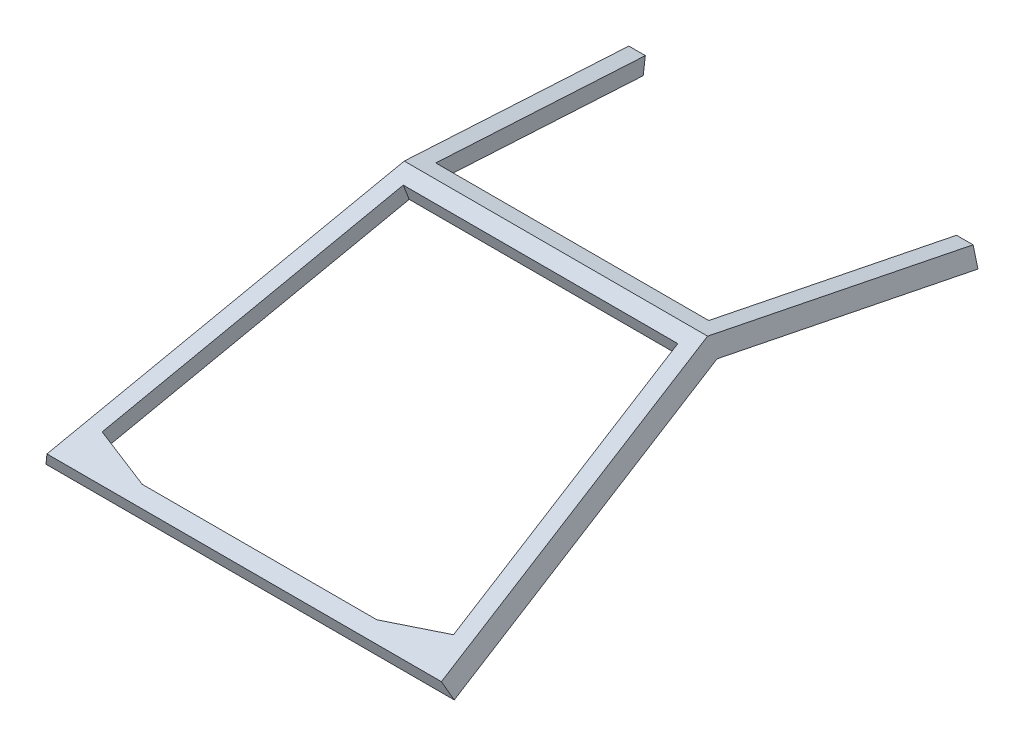
ISO-10303-21;
HEADER;
FILE_DESCRIPTION(('STEP AP214'),'2;1');
FILE_NAME('part.step','',(''),(''),'','','');
FILE_SCHEMA(('AUTOMOTIVE_DESIGN { 1 0 10303 214 1 1 1 1 }'));
ENDSEC;
DATA;
#1=APPLICATION_CONTEXT('core data for automotive mechanical design processes');
#2=APPLICATION_PROTOCOL_DEFINITION('international standard','automotive_design',2000,#1);
#3=PRODUCT_CONTEXT('',#1,'mechanical');
#4=PRODUCT('Part','Part','',(#3));
#5=PRODUCT_RELATED_PRODUCT_CATEGORY('part','',(#4));
#6=PRODUCT_DEFINITION_FORMATION('','',#4);
#7=PRODUCT_DEFINITION_CONTEXT('part definition',#1,'design');
#8=PRODUCT_DEFINITION('design','',#6,#7);
#9=PRODUCT_DEFINITION_SHAPE('','',#8);
#10=(LENGTH_UNIT() NAMED_UNIT(*) SI_UNIT(.MILLI.,.METRE.));
#11=(NAMED_UNIT(*) PLANE_ANGLE_UNIT() SI_UNIT($,.RADIAN.));
#12=(NAMED_UNIT(*) SI_UNIT($,.STERADIAN.) SOLID_ANGLE_UNIT());
#13=UNCERTAINTY_MEASURE_WITH_UNIT(LENGTH_MEASURE(1.E-05),#10,'distance_accuracy_value','');
#14=(GEOMETRIC_REPRESENTATION_CONTEXT(3) GLOBAL_UNCERTAINTY_ASSIGNED_CONTEXT((#13)) GLOBAL_UNIT_ASSIGNED_CONTEXT((#10,
#11,#12)) REPRESENTATION_CONTEXT('',''));
#15=CARTESIAN_POINT('',(0.,0.,0.));
#16=DIRECTION('',(0.,0.,1.));
#17=DIRECTION('',(1.,0.,0.));
#18=AXIS2_PLACEMENT_3D('',#15,#16,#17);
#19=CARTESIAN_POINT('',(0.,164.649706155274,63.6645530467058));
#20=DIRECTION('',(0.,-0.932703085043673,-0.360645192883553));
#21=DIRECTION('',(0.,0.360645192883553,-0.932703085043673));
#22=AXIS2_PLACEMENT_3D('',#19,#20,#21);
#23=PLANE('',#22);
#24=DIRECTION('',(-0.135068951217253,0.357340313044943,-0.924155982012784));
#25=VECTOR('',#24,1.);
#26=CARTESIAN_POINT('',(119.903816342687,73.0935278708853,300.447772747711));
#27=LINE('',#26,#25);
#28=CARTESIAN_POINT('',(118.281522677248,77.3854907612064,289.347868721018));
#29=VERTEX_POINT('',#28);
#30=CARTESIAN_POINT('',(106.635347964785,108.196774035582,209.663515425218));
#31=VERTEX_POINT('',#30);
#32=EDGE_CURVE('E335',#29,#31,#27,.T.);
#33=ORIENTED_EDGE('',*,*,#32,.F.);
#34=DIRECTION('',(-0.947950198198769,-0.114836146990365,0.296990035319911));
#35=VECTOR('',#34,1.);
#36=CARTESIAN_POINT('',(118.281522677248,77.3854907612063,289.347868721018));
#37=LINE('',#36,#35);
#38=CARTESIAN_POINT('',(100.5828713665,75.2414488829367,294.892804613095));
#39=VERTEX_POINT('',#38);
#40=EDGE_CURVE('E393',#29,#39,#37,.T.);
#41=ORIENTED_EDGE('',*,*,#40,.T.);
#42=DIRECTION('',(-1.,0.,0.));
#43=VECTOR('',#42,1.);
#44=CARTESIAN_POINT('',(65.,75.2414488829367,294.892804613095));
#45=LINE('',#44,#43);
#46=CARTESIAN_POINT('',(29.4171286334995,75.2414488829367,294.892804613095));
#47=VERTEX_POINT('',#46);
#48=EDGE_CURVE('E397',#39,#47,#45,.T.);
#49=ORIENTED_EDGE('',*,*,#48,.T.);
#50=DIRECTION('',(-0.947950198198769,0.114836146990365,-0.296990035319911));
#51=VECTOR('',#50,1.);
#52=CARTESIAN_POINT('',(11.7184773227523,77.3854907612063,289.347868721018));
#53=LINE('',#52,#51);
#54=CARTESIAN_POINT('',(11.7184773227524,77.3854907612064,289.347868721018));
#55=VERTEX_POINT('',#54);
#56=EDGE_CURVE('E398',#47,#55,#53,.T.);
#57=ORIENTED_EDGE('',*,*,#56,.T.);
#58=DIRECTION('',(-0.135068951217253,-0.357340313044943,0.924155982012784));
#59=VECTOR('',#58,1.);
#60=CARTESIAN_POINT('',(10.0961836573128,73.0935278708853,300.447772747711));
#61=LINE('',#60,#59);
#62=CARTESIAN_POINT('',(23.3646520352154,108.196774035582,209.663515425218));
#63=VERTEX_POINT('',#62);
#64=EDGE_CURVE('E457',#63,#55,#61,.T.);
#65=ORIENTED_EDGE('',*,*,#64,.F.);
#66=DIRECTION('',(-1.,0.,0.));
#67=VECTOR('',#66,1.);
#68=CARTESIAN_POINT('',(23.3646520352154,108.196774035582,209.663515425218));
#69=LINE('',#68,#67);
#70=EDGE_CURVE('E462',#31,#63,#69,.T.);
#71=ORIENTED_EDGE('',*,*,#70,.F.);
#72=EDGE_LOOP('',(#33,#41,#49,#57,#65,#71));
#73=FACE_BOUND('',#72,.T.);
#74=CARTESIAN_POINT('',(5.18023014824659,73.4382229185188,299.556320038313));
#75=DIRECTION('',(0.135068951217253,0.357340313044943,-0.924155982012784));
#76=VECTOR('',#75,1.);
#77=LINE('',#74,#76);
#78=CARTESIAN_POINT('',(5.18023014824665,73.4382229185189,299.556320038313));
#79=VERTEX_POINT('',#78);
#80=CARTESIAN_POINT('',(19.,110.,205.));
#81=VERTEX_POINT('',#80);
#82=EDGE_CURVE('E507',#79,#81,#77,.T.);
#83=ORIENTED_EDGE('',*,*,#82,.F.);
#84=DIRECTION('',(1.,0.,0.));
#85=VECTOR('',#84,1.);
#86=CARTESIAN_POINT('',(-6.41570742901576,73.4382229185189,299.556320038313));
#87=LINE('',#86,#85);
#88=CARTESIAN_POINT('',(124.819769851753,73.4382229185189,299.556320038313));
#89=VERTEX_POINT('',#88);
#90=EDGE_CURVE('E409',#79,#89,#87,.T.);
#91=ORIENTED_EDGE('',*,*,#90,.T.);
#92=DIRECTION('',(-0.135068951217253,0.357340313044943,-0.924155982012784));
#93=VECTOR('',#92,1.);
#94=CARTESIAN_POINT('',(130.,59.7333333333333,335.));
#95=LINE('',#94,#93);
#96=CARTESIAN_POINT('',(111.,110.,205.));
#97=VERTEX_POINT('',#96);
#98=EDGE_CURVE('E565',#89,#97,#95,.T.);
#99=ORIENTED_EDGE('',*,*,#98,.T.);
#100=DIRECTION('',(1.,0.,0.));
#101=VECTOR('',#100,1.);
#102=CARTESIAN_POINT('',(0.,110.,205.));
#103=LINE('',#102,#101);
#104=EDGE_CURVE('E615',#81,#97,#103,.T.);
#105=ORIENTED_EDGE('',*,*,#104,.F.);
#106=EDGE_LOOP('',(#83,#91,#99,#105));
#107=FACE_BOUND('',#106,.T.);
#108=ADVANCED_FACE('F192',(#73,#107),#23,.F.);
#109=CARTESIAN_POINT('',(0.,80.7859594277753,-10.929865099052));
#110=DIRECTION('',(0.,0.99097150999577,-0.134072616058251));
#111=DIRECTION('',(0.,0.134072616058251,0.99097150999577));
#112=AXIS2_PLACEMENT_3D('',#109,#110,#111);
#113=PLANE('',#112);
#114=DIRECTION('',(0.082492367586561,-0.133615655875355,-0.987593978209144));
#115=VECTOR('',#114,1.);
#116=CARTESIAN_POINT('',(106.396772641455,109.329636919709,200.045142450021));
#117=LINE('',#116,#115);
#118=CARTESIAN_POINT('',(106.396772641455,109.329636919709,200.045142450021));
#119=VERTEX_POINT('',#118);
#120=CARTESIAN_POINT('',(112.190986813663,99.9445537956311,130.677136750317));
#121=VERTEX_POINT('',#120);
#122=EDGE_CURVE('E441',#119,#121,#117,.T.);
#123=ORIENTED_EDGE('',*,*,#122,.F.);
#124=DIRECTION('',(1.,0.,0.));
#125=VECTOR('',#124,1.);
#126=CARTESIAN_POINT('',(23.6032273585454,109.329636919709,200.045142450021));
#127=LINE('',#126,#125);
#128=CARTESIAN_POINT('',(23.6032273585454,109.329636919709,200.045142450021));
#129=VERTEX_POINT('',#128);
#130=EDGE_CURVE('E445',#129,#119,#127,.T.);
#131=ORIENTED_EDGE('',*,*,#130,.F.);
#132=DIRECTION('',(0.0824923675865611,0.133615655875355,0.987593978209144));
#133=VECTOR('',#132,1.);
#134=CARTESIAN_POINT('',(23.6032273585454,109.329636919709,200.045142450021));
#135=LINE('',#134,#133);
#136=CARTESIAN_POINT('',(17.8090131863374,99.9445537956312,130.677136750317));
#137=VERTEX_POINT('',#136);
#138=EDGE_CURVE('E330',#137,#129,#135,.T.);
#139=ORIENTED_EDGE('',*,*,#138,.F.);
#140=DIRECTION('',(1.,0.,0.));
#141=VECTOR('',#140,1.);
#142=CARTESIAN_POINT('',(0.,99.9445537956311,130.677136750317));
#143=LINE('',#142,#141);
#144=CARTESIAN_POINT('',(12.7919133869202,99.9445537956311,130.677136750317));
#145=VERTEX_POINT('',#144);
#146=EDGE_CURVE('E576',#145,#137,#143,.T.);
#147=ORIENTED_EDGE('',*,*,#146,.F.);
#148=CARTESIAN_POINT('',(19.0000000000001,110.,205.));
#149=DIRECTION('',(-0.0824923675865611,-0.133615655875355,-0.987593978209144));
#150=VECTOR('',#149,1.);
#151=LINE('',#148,#150);
#152=EDGE_CURVE('E516',#81,#145,#151,.T.);
#153=ORIENTED_EDGE('',*,*,#152,.F.);
#154=ORIENTED_EDGE('',*,*,#104,.T.);
#155=CARTESIAN_POINT('',(111.,110.,205.));
#156=DIRECTION('',(0.082492367586561,-0.133615655875355,-0.987593978209144));
#157=VECTOR('',#156,1.);
#158=LINE('',#155,#157);
#159=CARTESIAN_POINT('',(117.20808661308,99.9445537956311,130.677136750317));
#160=VERTEX_POINT('',#159);
#161=EDGE_CURVE('E562',#97,#160,#158,.T.);
#162=ORIENTED_EDGE('',*,*,#161,.T.);
#163=EDGE_CURVE('E573',#121,#160,#143,.T.);
#164=ORIENTED_EDGE('',*,*,#163,.F.);
#165=EDGE_LOOP('',(#123,#131,#139,#147,#153,#154,#162,#164));
#166=FACE_BOUND('',#165,.T.);
#167=ADVANCED_FACE('F542',(#166),#113,.T.);
#168=CARTESIAN_POINT('',(137.599826435722,60.5491239754368,3.30158407348643));
#169=DIRECTION('',(0.915081624245218,0.402670498570365,0.0219565605190602));
#170=DIRECTION('',(-0.402767595499937,0.915302280132197,0.));
#171=AXIS2_PLACEMENT_3D('',#168,#169,#170);
#172=PLANE('',#171);
#173=DIRECTION('',(0.135068951217253,-0.357340313044943,0.924155982012784));
#174=VECTOR('',#173,1.);
#175=CARTESIAN_POINT('',(90.7522545245122,164.447796904632,50.3226904239006));
#176=LINE('',#175,#174);
#177=CARTESIAN_POINT('',(113.27067677839,104.87274294174,204.396105845172));
#178=VERTEX_POINT('',#177);
#179=CARTESIAN_POINT('',(126.915159673358,68.7747074933006,297.753094073895));
#180=VERTEX_POINT('',#179);
#181=EDGE_CURVE('E490',#178,#180,#176,.T.);
#182=ORIENTED_EDGE('',*,*,#181,.F.);
#183=DIRECTION('',(-0.0824923675865604,0.133615655875353,0.987593978209144));
#184=VECTOR('',#183,1.);
#185=CARTESIAN_POINT('',(130.30774604296,77.2772301618385,0.429272254592008));
#186=LINE('',#185,#184);
#187=CARTESIAN_POINT('',(119.372326436043,94.9896962456523,131.347499830608));
#188=VERTEX_POINT('',#187);
#189=EDGE_CURVE('E496',#188,#178,#186,.T.);
#190=ORIENTED_EDGE('',*,*,#189,.F.);
#191=DIRECTION('',(0.397232391805709,-0.909432445864631,0.123040860322863));
#192=VECTOR('',#191,1.);
#193=CARTESIAN_POINT('',(128.432024529086,74.2482271068976,134.15369859644));
#194=LINE('',#193,#192);
#195=EDGE_CURVE('E434',#160,#188,#194,.T.);
#196=ORIENTED_EDGE('',*,*,#195,.F.);
#197=ORIENTED_EDGE('',*,*,#161,.F.);
#198=ORIENTED_EDGE('',*,*,#98,.F.);
#199=DIRECTION('',(-0.386509498906153,0.860218462244048,0.332617805401034));
#200=VECTOR('',#199,1.);
#201=CARTESIAN_POINT('',(169.100869979237,-25.1141282292271,261.449410927851));
#202=LINE('',#201,#200);
#203=EDGE_CURVE('E433',#180,#89,#202,.T.);
#204=ORIENTED_EDGE('',*,*,#203,.F.);
#205=EDGE_LOOP('',(#182,#190,#196,#197,#198,#204));
#206=FACE_BOUND('',#205,.T.);
#207=ADVANCED_FACE('F536',(#206),#172,.T.);
#208=CARTESIAN_POINT('',(-7.59982643572174,60.5491239754368,3.30158407348643));
#209=DIRECTION('',(-0.915081624245218,0.402670498570365,0.0219565605190602));
#210=DIRECTION('',(0.402767595499937,0.915302280132197,0.));
#211=AXIS2_PLACEMENT_3D('',#208,#209,#210);
#212=PLANE('',#211);
#213=DIRECTION('',(-0.0824923675865604,-0.133615655875353,-0.987593978209144));
#214=VECTOR('',#213,1.);
#215=CARTESIAN_POINT('',(-0.307746042959867,77.2772301618385,0.429272254592008));
#216=LINE('',#215,#214);
#217=CARTESIAN_POINT('',(16.7293232216096,104.87274294174,204.396105845172));
#218=VERTEX_POINT('',#217);
#219=CARTESIAN_POINT('',(10.6276735639574,94.9896962456523,131.347499830608));
#220=VERTEX_POINT('',#219);
#221=EDGE_CURVE('E493',#218,#220,#216,.T.);
#222=ORIENTED_EDGE('',*,*,#221,.F.);
#223=DIRECTION('',(0.135068951217253,0.357340313044943,-0.924155982012784));
#224=VECTOR('',#223,1.);
#225=CARTESIAN_POINT('',(39.2477454754878,164.447796904632,50.3226904239006));
#226=LINE('',#225,#224);
#227=CARTESIAN_POINT('',(3.08484032664237,68.7747074933006,297.753094073895));
#228=VERTEX_POINT('',#227);
#229=EDGE_CURVE('E486',#228,#218,#226,.T.);
#230=ORIENTED_EDGE('',*,*,#229,.F.);
#231=DIRECTION('',(-0.386509498906153,-0.860218462244048,-0.332617805401034));
#232=VECTOR('',#231,1.);
#233=CARTESIAN_POINT('',(-39.1008699792369,-25.1141282292271,261.449410927851));
#234=LINE('',#233,#232);
#235=EDGE_CURVE('E429',#79,#228,#234,.T.);
#236=ORIENTED_EDGE('',*,*,#235,.F.);
#237=ORIENTED_EDGE('',*,*,#82,.T.);
#238=ORIENTED_EDGE('',*,*,#152,.T.);
#239=DIRECTION('',(0.397232391805709,0.909432445864631,-0.123040860322863));
#240=VECTOR('',#239,1.);
#241=CARTESIAN_POINT('',(1.56797547091377,74.2482271068976,134.15369859644));
#242=LINE('',#241,#240);
#243=EDGE_CURVE('E420',#220,#145,#242,.T.);
#244=ORIENTED_EDGE('',*,*,#243,.F.);
#245=EDGE_LOOP('',(#222,#230,#236,#237,#238,#244));
#246=FACE_BOUND('',#245,.T.);
#247=ADVANCED_FACE('F525',(#246),#212,.T.);
#248=CARTESIAN_POINT('',(-6.41570742901576,88.102741472655,247.766799299703));
#249=DIRECTION('',(0.,0.932703085043673,0.360645192883553));
#250=DIRECTION('',(0.,-0.360645192883553,0.932703085043673));
#251=AXIS2_PLACEMENT_3D('',#248,#249,#250);
#252=PLANE('',#251);
#253=ORIENTED_EDGE('',*,*,#181,.T.);
#254=DIRECTION('',(1.,0.,0.));
#255=VECTOR('',#254,1.);
#256=CARTESIAN_POINT('',(-6.41570742901576,68.7747074933006,297.753094073896));
#257=LINE('',#256,#255);
#258=EDGE_CURVE('E472',#228,#180,#257,.T.);
#259=ORIENTED_EDGE('',*,*,#258,.F.);
#260=ORIENTED_EDGE('',*,*,#229,.T.);
#261=DIRECTION('',(1.,0.,0.));
#262=VECTOR('',#261,1.);
#263=CARTESIAN_POINT('',(-6.41570742901576,104.87274294174,204.396105845172));
#264=LINE('',#263,#262);
#265=EDGE_CURVE('E479',#218,#178,#264,.T.);
#266=ORIENTED_EDGE('',*,*,#265,.T.);
#267=EDGE_LOOP('',(#253,#259,#260,#266));
#268=FACE_BOUND('',#267,.T.);
#269=DIRECTION('',(-0.947950198198768,0.114836146990367,-0.296990035319914));
#270=VECTOR('',#269,1.);
#271=CARTESIAN_POINT('',(-71.8483710605664,82.8453920541902,261.363392623319));
#272=LINE('',#271,#270);
#273=CARTESIAN_POINT('',(29.4171286334995,70.5779334577183,293.089578648677));
#274=VERTEX_POINT('',#273);
#275=CARTESIAN_POINT('',(11.7184773227524,72.7219753359879,287.5446427566));
#276=VERTEX_POINT('',#275);
#277=EDGE_CURVE('E363',#274,#276,#272,.T.);
#278=ORIENTED_EDGE('',*,*,#277,.F.);
#279=DIRECTION('',(-1.,0.,0.));
#280=VECTOR('',#279,1.);
#281=CARTESIAN_POINT('',(2.02560219300348E-13,70.5779334577183,293.089578648677));
#282=LINE('',#281,#280);
#283=CARTESIAN_POINT('',(100.5828713665,70.5779334577183,293.089578648677));
#284=VERTEX_POINT('',#283);
#285=EDGE_CURVE('E367',#284,#274,#282,.T.);
#286=ORIENTED_EDGE('',*,*,#285,.F.);
#287=DIRECTION('',(-0.947950198198769,-0.114836146990366,0.296990035319911));
#288=VECTOR('',#287,1.);
#289=CARTESIAN_POINT('',(85.0291258861047,68.6937287752029,297.962521793113));
#290=LINE('',#289,#288);
#291=CARTESIAN_POINT('',(118.281522677248,72.7219753359879,287.5446427566));
#292=VERTEX_POINT('',#291);
#293=EDGE_CURVE('E371',#292,#284,#290,.T.);
#294=ORIENTED_EDGE('',*,*,#293,.F.);
#295=DIRECTION('',(0.135068951217253,-0.357340313044943,0.924155982012784));
#296=VECTOR('',#295,1.);
#297=CARTESIAN_POINT('',(83.740911193842,164.103101856998,51.2141431332983));
#298=LINE('',#297,#296);
#299=CARTESIAN_POINT('',(106.635347964785,103.533258610364,207.860289460801));
#300=VERTEX_POINT('',#299);
#301=EDGE_CURVE('E375',#300,#292,#298,.T.);
#302=ORIENTED_EDGE('',*,*,#301,.F.);
#303=DIRECTION('',(1.,0.,0.));
#304=VECTOR('',#303,1.);
#305=CARTESIAN_POINT('',(1.02088905134145E-13,103.533258610364,207.860289460801));
#306=LINE('',#305,#304);
#307=CARTESIAN_POINT('',(23.3646520352154,103.533258610364,207.860289460801));
#308=VERTEX_POINT('',#307);
#309=EDGE_CURVE('E379',#308,#300,#306,.T.);
#310=ORIENTED_EDGE('',*,*,#309,.F.);
#311=DIRECTION('',(0.135068951217253,0.357340313044943,-0.924155982012784));
#312=VECTOR('',#311,1.);
#313=CARTESIAN_POINT('',(43.8874180003773,157.828576286617,67.4413644360085));
#314=LINE('',#313,#312);
#315=EDGE_CURVE('E383',#276,#308,#314,.T.);
#316=ORIENTED_EDGE('',*,*,#315,.F.);
#317=EDGE_LOOP('',(#278,#286,#294,#302,#310,#316));
#318=FACE_BOUND('',#317,.T.);
#319=ADVANCED_FACE('F535',(#268,#318),#252,.F.);
#320=CARTESIAN_POINT('',(-6.41570742901576,101.655183032465,180.614141298353));
#321=DIRECTION('',(0.,0.99097150999577,-0.13407261605825));
#322=DIRECTION('',(0.,0.13407261605825,0.99097150999577));
#323=AXIS2_PLACEMENT_3D('',#320,#321,#322);
#324=PLANE('',#323);
#325=ORIENTED_EDGE('',*,*,#189,.T.);
#326=ORIENTED_EDGE('',*,*,#265,.F.);
#327=ORIENTED_EDGE('',*,*,#221,.T.);
#328=DIRECTION('',(1.,0.,0.));
#329=VECTOR('',#328,1.);
#330=CARTESIAN_POINT('',(-6.41570742901576,94.9896962456523,131.347499830608));
#331=LINE('',#330,#329);
#332=CARTESIAN_POINT('',(17.8090131863374,94.9896962456523,131.347499830608));
#333=VERTEX_POINT('',#332);
#334=EDGE_CURVE('E351',#220,#333,#331,.T.);
#335=ORIENTED_EDGE('',*,*,#334,.T.);
#336=DIRECTION('',(0.0824923675865611,0.133615655875353,0.987593978209144));
#337=VECTOR('',#336,1.);
#338=CARTESIAN_POINT('',(17.8090131863374,94.9896962456523,131.347499830608));
#339=LINE('',#338,#337);
#340=CARTESIAN_POINT('',(23.6032273585454,104.37477936973,200.715505530313));
#341=VERTEX_POINT('',#340);
#342=EDGE_CURVE('E328',#333,#341,#339,.T.);
#343=ORIENTED_EDGE('',*,*,#342,.T.);
#344=DIRECTION('',(1.,0.,0.));
#345=VECTOR('',#344,1.);
#346=CARTESIAN_POINT('',(23.6032273585454,104.37477936973,200.715505530313));
#347=LINE('',#346,#345);
#348=CARTESIAN_POINT('',(106.396772641455,104.37477936973,200.715505530313));
#349=VERTEX_POINT('',#348);
#350=EDGE_CURVE('E339',#341,#349,#347,.T.);
#351=ORIENTED_EDGE('',*,*,#350,.T.);
#352=DIRECTION('',(0.0824923675867372,-0.133615655875226,-0.987593978209146));
#353=VECTOR('',#352,1.);
#354=CARTESIAN_POINT('',(112.190986813663,94.9896962456523,131.347499830609));
#355=LINE('',#354,#353);
#356=CARTESIAN_POINT('',(112.190986813663,94.9896962456523,131.347499830609));
#357=VERTEX_POINT('',#356);
#358=EDGE_CURVE('E346',#349,#357,#355,.T.);
#359=ORIENTED_EDGE('',*,*,#358,.T.);
#360=EDGE_CURVE('E475',#357,#188,#331,.T.);
#361=ORIENTED_EDGE('',*,*,#360,.T.);
#362=EDGE_LOOP('',(#325,#326,#327,#335,#343,#351,#359,#361));
#363=FACE_BOUND('',#362,.T.);
#364=ADVANCED_FACE('F349',(#363),#324,.F.);
#365=CARTESIAN_POINT('',(119.903816342687,-90.2421185070811,237.291322814897));
#366=DIRECTION('',(0.990836201608052,0.0487119679643254,-0.125979227493945));
#367=DIRECTION('',(-0.126128959287433,0.,-0.99201385354695));
#368=AXIS2_PLACEMENT_3D('',#365,#366,#367);
#369=PLANE('',#368);
#370=DIRECTION('',(0.,0.932703085043673,0.360645192883553));
#371=VECTOR('',#370,1.);
#372=CARTESIAN_POINT('',(118.281522677248,-28.0961986979211,248.561615463489));
#373=LINE('',#372,#371);
#374=EDGE_CURVE('E410',#292,#29,#373,.T.);
#375=ORIENTED_EDGE('',*,*,#374,.T.);
#376=ORIENTED_EDGE('',*,*,#32,.T.);
#377=DIRECTION('',(0.,0.932703085043673,0.360645192883553));
#378=VECTOR('',#377,1.);
#379=CARTESIAN_POINT('',(106.635347964785,-55.1388723423842,146.507065492405));
#380=LINE('',#379,#378);
#381=EDGE_CURVE('E461',#300,#31,#380,.T.);
#382=ORIENTED_EDGE('',*,*,#381,.F.);
#383=ORIENTED_EDGE('',*,*,#301,.T.);
#384=EDGE_LOOP('',(#375,#376,#382,#383));
#385=FACE_BOUND('',#384,.T.);
#386=ADVANCED_FACE('F670',(#385),#369,.F.);
#387=CARTESIAN_POINT('',(23.3646520352154,-55.1388723423842,146.507065492405));
#388=DIRECTION('',(0.,0.360645192883553,-0.932703085043673));
#389=DIRECTION('',(0.,0.932703085043673,0.360645192883553));
#390=AXIS2_PLACEMENT_3D('',#387,#388,#389);
#391=PLANE('',#390);
#392=ORIENTED_EDGE('',*,*,#381,.T.);
#393=ORIENTED_EDGE('',*,*,#70,.T.);
#394=DIRECTION('',(0.,0.932703085043673,0.360645192883553));
#395=VECTOR('',#394,1.);
#396=CARTESIAN_POINT('',(23.3646520352154,-55.1388723423842,146.507065492405));
#397=LINE('',#396,#395);
#398=EDGE_CURVE('E469',#308,#63,#397,.T.);
#399=ORIENTED_EDGE('',*,*,#398,.F.);
#400=ORIENTED_EDGE('',*,*,#309,.T.);
#401=EDGE_LOOP('',(#392,#393,#399,#400));
#402=FACE_BOUND('',#401,.T.);
#403=ADVANCED_FACE('F668',(#402),#391,.F.);
#404=CARTESIAN_POINT('',(10.0961836573128,-90.2421185070811,237.291322814897));
#405=DIRECTION('',(-0.990836201608052,0.0487119679643254,-0.125979227493945));
#406=DIRECTION('',(-0.126128959287433,0.,0.99201385354695));
#407=AXIS2_PLACEMENT_3D('',#404,#405,#406);
#408=PLANE('',#407);
#409=ORIENTED_EDGE('',*,*,#398,.T.);
#410=ORIENTED_EDGE('',*,*,#64,.T.);
#411=DIRECTION('',(0.,0.932703085043673,0.360645192883553));
#412=VECTOR('',#411,1.);
#413=CARTESIAN_POINT('',(11.7184773227523,-28.0961986979211,248.561615463489));
#414=LINE('',#413,#412);
#415=EDGE_CURVE('E413',#276,#55,#414,.T.);
#416=ORIENTED_EDGE('',*,*,#415,.F.);
#417=ORIENTED_EDGE('',*,*,#315,.T.);
#418=EDGE_LOOP('',(#409,#410,#416,#417));
#419=FACE_BOUND('',#418,.T.);
#420=ADVANCED_FACE('F665',(#419),#408,.F.);
#421=CARTESIAN_POINT('',(23.6032273585454,-37.0280414925888,219.846475411685));
#422=DIRECTION('',(0.,0.134072616058251,0.99097150999577));
#423=DIRECTION('',(0.,-0.99097150999577,0.134072616058251));
#424=AXIS2_PLACEMENT_3D('',#421,#422,#423);
#425=PLANE('',#424);
#426=ORIENTED_EDGE('',*,*,#130,.T.);
#427=DIRECTION('',(0.,0.99097150999577,-0.134072616058251));
#428=VECTOR('',#427,1.);
#429=CARTESIAN_POINT('',(106.396772641455,-37.0280414925888,219.846475411685));
#430=LINE('',#429,#428);
#431=EDGE_CURVE('E341',#349,#119,#430,.T.);
#432=ORIENTED_EDGE('',*,*,#431,.F.);
#433=ORIENTED_EDGE('',*,*,#350,.F.);
#434=DIRECTION('',(0.,0.99097150999577,-0.134072616058251));
#435=VECTOR('',#434,1.);
#436=CARTESIAN_POINT('',(23.6032273585454,-37.0280414925888,219.846475411685));
#437=LINE('',#436,#435);
#438=EDGE_CURVE('E324',#341,#129,#437,.T.);
#439=ORIENTED_EDGE('',*,*,#438,.T.);
#440=EDGE_LOOP('',(#426,#432,#433,#439));
#441=FACE_BOUND('',#440,.T.);
#442=ADVANCED_FACE('F340',(#441),#425,.F.);
#443=CARTESIAN_POINT('',(106.396772641455,-37.0280414925888,219.846475411685));
#444=DIRECTION('',(0.996591696378193,0.0110599675271691,0.0817475860703805));
#445=DIRECTION('',(0.0817525863292699,0.,-0.996652654954812));
#446=AXIS2_PLACEMENT_3D('',#443,#444,#445);
#447=PLANE('',#446);
#448=ORIENTED_EDGE('',*,*,#122,.T.);
#449=DIRECTION('',(0.,0.99097150999577,-0.134072616058251));
#450=VECTOR('',#449,1.);
#451=CARTESIAN_POINT('',(112.190986813663,-46.4131246166664,150.478469711981));
#452=LINE('',#451,#450);
#453=EDGE_CURVE('E452',#357,#121,#452,.T.);
#454=ORIENTED_EDGE('',*,*,#453,.F.);
#455=ORIENTED_EDGE('',*,*,#358,.F.);
#456=ORIENTED_EDGE('',*,*,#431,.T.);
#457=EDGE_LOOP('',(#448,#454,#455,#456));
#458=FACE_BOUND('',#457,.T.);
#459=ADVANCED_FACE('F755',(#458),#447,.F.);
#460=CARTESIAN_POINT('',(23.6032273585454,-37.0280414925888,219.846475411685));
#461=DIRECTION('',(-0.996591696378193,0.0110599675271691,0.0817475860703805));
#462=DIRECTION('',(0.0817525863292699,0.,0.996652654954812));
#463=AXIS2_PLACEMENT_3D('',#460,#461,#462);
#464=PLANE('',#463);
#465=ORIENTED_EDGE('',*,*,#438,.F.);
#466=ORIENTED_EDGE('',*,*,#342,.F.);
#467=DIRECTION('',(0.,0.99097150999577,-0.134072616058251));
#468=VECTOR('',#467,1.);
#469=CARTESIAN_POINT('',(17.8090131863374,-46.4131246166664,150.478469711981));
#470=LINE('',#469,#468);
#471=EDGE_CURVE('E336',#333,#137,#470,.T.);
#472=ORIENTED_EDGE('',*,*,#471,.T.);
#473=ORIENTED_EDGE('',*,*,#138,.T.);
#474=EDGE_LOOP('',(#465,#466,#472,#473));
#475=FACE_BOUND('',#474,.T.);
#476=ADVANCED_FACE('F326',(#475),#464,.F.);
#477=CARTESIAN_POINT('',(-6.41570742901576,94.9896962456523,131.347499830608));
#478=DIRECTION('',(0.,0.134072616058253,0.99097150999577));
#479=DIRECTION('',(0.,-0.99097150999577,0.134072616058253));
#480=AXIS2_PLACEMENT_3D('',#477,#478,#479);
#481=PLANE('',#480);
#482=ORIENTED_EDGE('',*,*,#471,.F.);
#483=ORIENTED_EDGE('',*,*,#334,.F.);
#484=ORIENTED_EDGE('',*,*,#243,.T.);
#485=ORIENTED_EDGE('',*,*,#146,.T.);
#486=EDGE_LOOP('',(#482,#483,#484,#485));
#487=FACE_BOUND('',#486,.T.);
#488=ADVANCED_FACE('F622',(#487),#481,.F.);
#489=ORIENTED_EDGE('',*,*,#360,.F.);
#490=ORIENTED_EDGE('',*,*,#453,.T.);
#491=ORIENTED_EDGE('',*,*,#163,.T.);
#492=ORIENTED_EDGE('',*,*,#195,.T.);
#493=EDGE_LOOP('',(#489,#490,#491,#492));
#494=FACE_BOUND('',#493,.T.);
#495=ADVANCED_FACE('F631',(#494),#481,.F.);
#496=CARTESIAN_POINT('',(-6.41570742901576,68.7747074933006,297.753094073895));
#497=DIRECTION('',(0.,0.360645192883556,-0.932703085043672));
#498=DIRECTION('',(0.,0.932703085043672,0.360645192883556));
#499=AXIS2_PLACEMENT_3D('',#496,#497,#498);
#500=PLANE('',#499);
#501=ORIENTED_EDGE('',*,*,#235,.T.);
#502=ORIENTED_EDGE('',*,*,#258,.T.);
#503=ORIENTED_EDGE('',*,*,#203,.T.);
#504=ORIENTED_EDGE('',*,*,#90,.F.);
#505=EDGE_LOOP('',(#501,#502,#503,#504));
#506=FACE_BOUND('',#505,.T.);
#507=ADVANCED_FACE('F628',(#506),#500,.F.);
#508=CARTESIAN_POINT('',(65.,-30.2402405761907,254.106551355566));
#509=DIRECTION('',(0.,0.360645192883553,-0.932703085043673));
#510=DIRECTION('',(0.,0.932703085043673,0.360645192883553));
#511=AXIS2_PLACEMENT_3D('',#508,#509,#510);
#512=PLANE('',#511);
#513=DIRECTION('',(0.,0.932703085043673,0.360645192883553));
#514=VECTOR('',#513,1.);
#515=CARTESIAN_POINT('',(29.4171286334995,-30.2402405761907,254.106551355566));
#516=LINE('',#515,#514);
#517=EDGE_CURVE('E402',#274,#47,#516,.T.);
#518=ORIENTED_EDGE('',*,*,#517,.T.);
#519=ORIENTED_EDGE('',*,*,#48,.F.);
#520=DIRECTION('',(0.,0.932703085043673,0.360645192883553));
#521=VECTOR('',#520,1.);
#522=CARTESIAN_POINT('',(100.5828713665,-30.2402405761907,254.106551355566));
#523=LINE('',#522,#521);
#524=EDGE_CURVE('E406',#284,#39,#523,.T.);
#525=ORIENTED_EDGE('',*,*,#524,.F.);
#526=ORIENTED_EDGE('',*,*,#285,.T.);
#527=EDGE_LOOP('',(#518,#519,#525,#526));
#528=FACE_BOUND('',#527,.T.);
#529=ADVANCED_FACE('F630',(#528),#512,.T.);
#530=CARTESIAN_POINT('',(11.7184773227523,-28.0961986979211,248.561615463489));
#531=DIRECTION('',(0.318418626551454,0.341873682073398,-0.884156074327753));
#532=DIRECTION('',(0.,0.932703085043673,0.360645192883553));
#533=AXIS2_PLACEMENT_3D('',#530,#531,#532);
#534=PLANE('',#533);
#535=ORIENTED_EDGE('',*,*,#415,.T.);
#536=ORIENTED_EDGE('',*,*,#56,.F.);
#537=ORIENTED_EDGE('',*,*,#517,.F.);
#538=ORIENTED_EDGE('',*,*,#277,.T.);
#539=EDGE_LOOP('',(#535,#536,#537,#538));
#540=FACE_BOUND('',#539,.T.);
#541=ADVANCED_FACE('F637',(#540),#534,.T.);
#542=CARTESIAN_POINT('',(118.281522677248,-28.0961986979211,248.561615463489));
#543=DIRECTION('',(-0.318418626551455,0.341873682073398,-0.884156074327753));
#544=DIRECTION('',(0.,0.932703085043673,0.360645192883553));
#545=AXIS2_PLACEMENT_3D('',#542,#543,#544);
#546=PLANE('',#545);
#547=ORIENTED_EDGE('',*,*,#524,.T.);
#548=ORIENTED_EDGE('',*,*,#40,.F.);
#549=ORIENTED_EDGE('',*,*,#374,.F.);
#550=ORIENTED_EDGE('',*,*,#293,.T.);
#551=EDGE_LOOP('',(#547,#548,#549,#550));
#552=FACE_BOUND('',#551,.T.);
#553=ADVANCED_FACE('F656',(#552),#546,.T.);
#554=CLOSED_SHELL('',(#108,#167,#207,#247,#319,#364,#386,#403,#420,#442,#459,#476,#488,#495,
#507,#529,#541,#553));
#555=CARTESIAN_POINT('',(20.0502940730652,107.91461727504,204.503590891045));
#556=DIRECTION('',(0.,0.13407261605825,0.99097150999577));
#557=DIRECTION('',(0.,-0.990971509995771,0.13407261605825));
#558=AXIS2_PLACEMENT_3D('',#555,#556,#557);
#559=PLANE('',#558);
#560=DIRECTION('',(1.,0.,0.));
#561=VECTOR('',#560,1.);
#562=CARTESIAN_POINT('',(0.,106.923645765044,204.637663507103));
#563=LINE('',#562,#561);
#564=CARTESIAN_POINT('',(20.9159900022503,106.923645765044,204.637663507103));
#565=VERTEX_POINT('',#564);
#566=CARTESIAN_POINT('',(109.08400999775,106.923645765044,204.637663507103));
#567=VERTEX_POINT('',#566);
#568=EDGE_CURVE('E503',#565,#567,#563,.T.);
#569=ORIENTED_EDGE('',*,*,#568,.F.);
#570=DIRECTION('',(0.397232391805709,0.909432445864631,-0.12304086032286));
#571=VECTOR('',#570,1.);
#572=CARTESIAN_POINT('',(9.50376702192689,80.7962551699076,208.172545764092));
#573=LINE('',#572,#571);
#574=CARTESIAN_POINT('',(20.4545142854458,105.867133258768,204.780603434423));
#575=VERTEX_POINT('',#574);
#576=EDGE_CURVE('E357',#575,#565,#573,.T.);
#577=ORIENTED_EDGE('',*,*,#576,.F.);
#578=DIRECTION('',(1.,0.,0.));
#579=VECTOR('',#578,1.);
#580=CARTESIAN_POINT('',(1.0340546992544E-13,105.867133258768,204.780603434423));
#581=LINE('',#580,#579);
#582=CARTESIAN_POINT('',(109.545485714554,105.867133258768,204.780603434423));
#583=VERTEX_POINT('',#582);
#584=EDGE_CURVE('E13',#575,#583,#581,.T.);
#585=ORIENTED_EDGE('',*,*,#584,.T.);
#586=DIRECTION('',(0.397232391805709,-0.909432445864631,0.12304086032286));
#587=VECTOR('',#586,1.);
#588=CARTESIAN_POINT('',(120.496232978073,80.7962551699076,208.172545764092));
#589=LINE('',#588,#587);
#590=EDGE_CURVE('E360',#567,#583,#589,.T.);
#591=ORIENTED_EDGE('',*,*,#590,.F.);
#592=EDGE_LOOP('',(#569,#577,#585,#591));
#593=FACE_BOUND('',#592,.T.);
#594=ADVANCED_FACE('F693',(#593),#559,.T.);
#595=CARTESIAN_POINT('',(1.01189915342131E-13,107.670852196871,205.478041423823));
#596=DIRECTION('',(0.,0.360645192883553,-0.932703085043673));
#597=DIRECTION('',(0.,0.932703085043673,0.360645192883553));
#598=AXIS2_PLACEMENT_3D('',#595,#596,#597);
#599=PLANE('',#598);
#600=ORIENTED_EDGE('',*,*,#584,.F.);
#601=DIRECTION('',(-0.386509498906154,-0.860218462244049,-0.332617805401032));
#602=VECTOR('',#601,1.);
#603=CARTESIAN_POINT('',(-24.706093011522,5.35734430675706,165.916818372979));
#604=LINE('',#603,#602);
#605=CARTESIAN_POINT('',(20.8458752195358,106.738149111828,205.117396230939));
#606=VERTEX_POINT('',#605);
#607=EDGE_CURVE('E202',#606,#575,#604,.T.);
#608=ORIENTED_EDGE('',*,*,#607,.F.);
#609=DIRECTION('',(1.,0.,0.));
#610=VECTOR('',#609,1.);
#611=CARTESIAN_POINT('',(0.,106.738149111828,205.117396230939));
#612=LINE('',#611,#610);
#613=CARTESIAN_POINT('',(109.154124780464,106.738149111828,205.117396230939));
#614=VERTEX_POINT('',#613);
#615=EDGE_CURVE('E387',#606,#614,#612,.T.);
#616=ORIENTED_EDGE('',*,*,#615,.T.);
#617=DIRECTION('',(-0.386509498906153,0.860218462244048,0.332617805401032));
#618=VECTOR('',#617,1.);
#619=CARTESIAN_POINT('',(154.706093011522,5.35734430675701,165.916818372979));
#620=LINE('',#619,#618);
#621=EDGE_CURVE('E214',#583,#614,#620,.T.);
#622=ORIENTED_EDGE('',*,*,#621,.F.);
#623=EDGE_LOOP('',(#600,#608,#616,#622));
#624=FACE_BOUND('',#623,.T.);
#625=ADVANCED_FACE('F691',(#624),#599,.T.);
#626=CARTESIAN_POINT('',(-4.85458156298609,59.3411124797257,3.23571439192925));
#627=DIRECTION('',(-0.915081624245218,0.402670498570365,0.0219565605190602));
#628=DIRECTION('',(0.402767595499937,0.915302280132197,0.));
#629=AXIS2_PLACEMENT_3D('',#626,#627,#628);
#630=PLANE('',#629);
#631=ORIENTED_EDGE('',*,*,#607,.T.);
#632=ORIENTED_EDGE('',*,*,#576,.T.);
#633=DIRECTION('',(0.135068951217253,0.357340313044943,-0.924155982012784));
#634=VECTOR('',#633,1.);
#635=CARTESIAN_POINT('',(40.9175258507566,159.839989729163,67.785049806797));
#636=LINE('',#635,#634);
#637=EDGE_CURVE('E499',#606,#565,#636,.T.);
#638=ORIENTED_EDGE('',*,*,#637,.F.);
#639=EDGE_LOOP('',(#631,#632,#638));
#640=FACE_BOUND('',#639,.T.);
#641=ADVANCED_FACE('F537',(#640),#630,.F.);
#642=CARTESIAN_POINT('',(134.854581562986,59.3411124797257,3.23571439192925));
#643=DIRECTION('',(0.915081624245218,0.402670498570365,0.0219565605190602));
#644=DIRECTION('',(-0.402767595499937,0.915302280132197,0.));
#645=AXIS2_PLACEMENT_3D('',#642,#643,#644);
#646=PLANE('',#645);
#647=DIRECTION('',(-0.135068951217253,0.357340313044943,-0.924155982012784));
#648=VECTOR('',#647,1.);
#649=CARTESIAN_POINT('',(86.7108033434626,166.114515299544,51.5578285040867));
#650=LINE('',#649,#648);
#651=EDGE_CURVE('E500',#614,#567,#650,.T.);
#652=ORIENTED_EDGE('',*,*,#651,.T.);
#653=ORIENTED_EDGE('',*,*,#590,.T.);
#654=ORIENTED_EDGE('',*,*,#621,.T.);
#655=EDGE_LOOP('',(#652,#653,#654));
#656=FACE_BOUND('',#655,.T.);
#657=ADVANCED_FACE('F683',(#656),#646,.F.);
#658=CARTESIAN_POINT('',(0.,161.851596900143,62.5826174680552));
#659=DIRECTION('',(0.,-0.932703085043673,-0.360645192883553));
#660=DIRECTION('',(0.,0.360645192883553,-0.932703085043673));
#661=AXIS2_PLACEMENT_3D('',#658,#659,#660);
#662=PLANE('',#661);
#663=ORIENTED_EDGE('',*,*,#615,.F.);
#664=ORIENTED_EDGE('',*,*,#637,.T.);
#665=ORIENTED_EDGE('',*,*,#568,.T.);
#666=ORIENTED_EDGE('',*,*,#651,.F.);
#667=EDGE_LOOP('',(#663,#664,#665,#666));
#668=FACE_BOUND('',#667,.T.);
#669=ADVANCED_FACE('F681',(#668),#662,.T.);
#670=CLOSED_SHELL('',(#594,#625,#641,#657,#669));
#671=ORIENTED_CLOSED_SHELL('',*,#670,.T.);
#672=BREP_WITH_VOIDS('B2',#554,(#671));
#673=ADVANCED_BREP_SHAPE_REPRESENTATION('',(#18,#672),#14);
#674=SHAPE_DEFINITION_REPRESENTATION(#9,#673);
ENDSEC;
END-ISO-10303-21;
